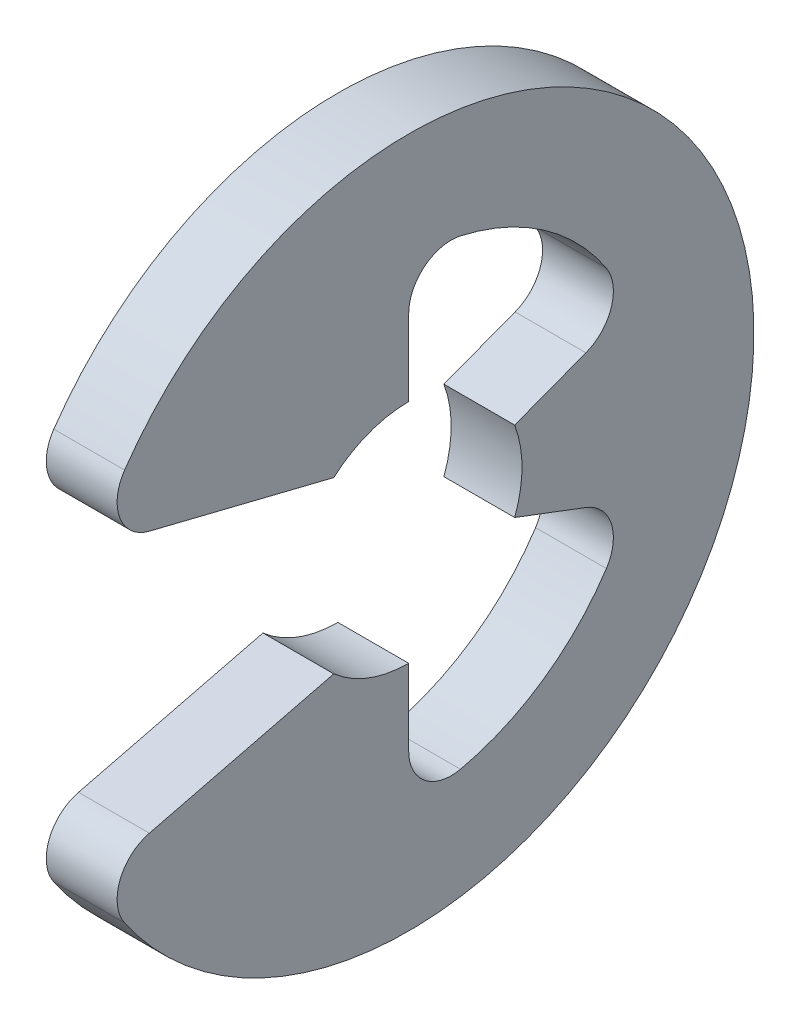
ISO-10303-21;
HEADER;
FILE_DESCRIPTION(('STEP AP214'),'2;1');
FILE_NAME('part.step','',(''),(''),'','','');
FILE_SCHEMA(('AUTOMOTIVE_DESIGN { 1 0 10303 214 1 1 1 1 }'));
ENDSEC;
DATA;
#1=APPLICATION_CONTEXT('core data for automotive mechanical design processes');
#2=APPLICATION_PROTOCOL_DEFINITION('international standard','automotive_design',2000,#1);
#3=PRODUCT_CONTEXT('',#1,'mechanical');
#4=PRODUCT('Part','Part','',(#3));
#5=PRODUCT_RELATED_PRODUCT_CATEGORY('part','',(#4));
#6=PRODUCT_DEFINITION_FORMATION('','',#4);
#7=PRODUCT_DEFINITION_CONTEXT('part definition',#1,'design');
#8=PRODUCT_DEFINITION('design','',#6,#7);
#9=PRODUCT_DEFINITION_SHAPE('','',#8);
#10=(LENGTH_UNIT() NAMED_UNIT(*) SI_UNIT(.MILLI.,.METRE.));
#11=(NAMED_UNIT(*) PLANE_ANGLE_UNIT() SI_UNIT($,.RADIAN.));
#12=(NAMED_UNIT(*) SI_UNIT($,.STERADIAN.) SOLID_ANGLE_UNIT());
#13=UNCERTAINTY_MEASURE_WITH_UNIT(LENGTH_MEASURE(1.E-05),#10,'distance_accuracy_value','');
#14=(GEOMETRIC_REPRESENTATION_CONTEXT(3) GLOBAL_UNCERTAINTY_ASSIGNED_CONTEXT((#13)) GLOBAL_UNIT_ASSIGNED_CONTEXT((#10,
#11,#12)) REPRESENTATION_CONTEXT('',''));
#15=CARTESIAN_POINT('',(0.,0.,0.));
#16=DIRECTION('',(0.,0.,1.));
#17=DIRECTION('',(1.,0.,0.));
#18=AXIS2_PLACEMENT_3D('',#15,#16,#17);
#19=CARTESIAN_POINT('',(0.2,0.,0.));
#20=DIRECTION('',(-1.,0.,0.));
#21=DIRECTION('',(0.,0.,1.));
#22=AXIS2_PLACEMENT_3D('',#19,#20,#21);
#23=CYLINDRICAL_SURFACE('',#22,1.95);
#24=CARTESIAN_POINT('',(0.2,0.,0.));
#25=DIRECTION('',(1.,0.,0.));
#26=DIRECTION('',(0.,0.,-1.));
#27=AXIS2_PLACEMENT_3D('',#24,#25,#26);
#28=CIRCLE('',#27,1.95);
#29=CARTESIAN_POINT('',(0.2,-1.10790730613089,1.60469355361757));
#30=VERTEX_POINT('',#29);
#31=CARTESIAN_POINT('',(0.2,1.10790730613089,1.60469355361757));
#32=VERTEX_POINT('',#31);
#33=EDGE_CURVE('E170',#30,#32,#28,.T.);
#34=ORIENTED_EDGE('',*,*,#33,.F.);
#35=DIRECTION('',(-1.,0.,0.));
#36=VECTOR('',#35,1.);
#37=CARTESIAN_POINT('',(0.2,-1.10790730613089,1.60469355361757));
#38=LINE('',#37,#36);
#39=CARTESIAN_POINT('',(-0.2,-1.10790730613089,1.60469355361757));
#40=VERTEX_POINT('',#39);
#41=EDGE_CURVE('E264',#30,#40,#38,.T.);
#42=ORIENTED_EDGE('',*,*,#41,.T.);
#43=CARTESIAN_POINT('',(-0.2,0.,0.));
#44=DIRECTION('',(1.,0.,0.));
#45=DIRECTION('',(0.,0.,-1.));
#46=AXIS2_PLACEMENT_3D('',#43,#44,#45);
#47=CIRCLE('',#46,1.95);
#48=CARTESIAN_POINT('',(-0.2,1.10790730613089,1.60469355361757));
#49=VERTEX_POINT('',#48);
#50=EDGE_CURVE('E208',#40,#49,#47,.T.);
#51=ORIENTED_EDGE('',*,*,#50,.T.);
#52=DIRECTION('',(-1.,0.,0.));
#53=VECTOR('',#52,1.);
#54=CARTESIAN_POINT('',(0.2,1.10790730613089,1.60469355361757));
#55=LINE('',#54,#53);
#56=EDGE_CURVE('E262',#49,#32,#55,.F.);
#57=ORIENTED_EDGE('',*,*,#56,.T.);
#58=EDGE_LOOP('',(#34,#42,#51,#57));
#59=FACE_BOUND('',#58,.T.);
#60=ADVANCED_FACE('F32',(#59),#23,.T.);
#61=CARTESIAN_POINT('',(0.2,0.81474305930666,1.77163589580693));
#62=DIRECTION('',(0.,0.970536829925373,-0.240952820606872));
#63=DIRECTION('',(0.,0.240952820606872,0.970536829925373));
#64=AXIS2_PLACEMENT_3D('',#61,#62,#63);
#65=PLANE('',#64);
#66=DIRECTION('',(0.,-0.240952820606872,-0.970536829925373));
#67=VECTOR('',#66,1.);
#68=CARTESIAN_POINT('',(0.2,0.81474305930666,1.77163589580693));
#69=LINE('',#68,#67);
#70=CARTESIAN_POINT('',(0.2,0.738620644655768,1.4650214855026));
#71=VERTEX_POINT('',#70);
#72=CARTESIAN_POINT('',(0.2,0.48,0.423320209770334));
#73=VERTEX_POINT('',#72);
#74=EDGE_CURVE('E156',#71,#73,#69,.T.);
#75=ORIENTED_EDGE('',*,*,#74,.F.);
#76=DIRECTION('',(-1.,0.,0.));
#77=VECTOR('',#76,1.);
#78=CARTESIAN_POINT('',(0.2,0.738620644655768,1.4650214855026));
#79=LINE('',#78,#77);
#80=CARTESIAN_POINT('',(-0.2,0.738620644655768,1.4650214855026));
#81=VERTEX_POINT('',#80);
#82=EDGE_CURVE('E276',#71,#81,#79,.T.);
#83=ORIENTED_EDGE('',*,*,#82,.T.);
#84=DIRECTION('',(0.,-0.240952820606872,-0.970536829925373));
#85=VECTOR('',#84,1.);
#86=CARTESIAN_POINT('',(-0.2,0.81474305930666,1.77163589580693));
#87=LINE('',#86,#85);
#88=CARTESIAN_POINT('',(-0.2,0.48,0.423320209770334));
#89=VERTEX_POINT('',#88);
#90=EDGE_CURVE('E176',#81,#89,#87,.T.);
#91=ORIENTED_EDGE('',*,*,#90,.T.);
#92=DIRECTION('',(-1.,0.,0.));
#93=VECTOR('',#92,1.);
#94=CARTESIAN_POINT('',(0.2,0.48,0.423320209770334));
#95=LINE('',#94,#93);
#96=EDGE_CURVE('E173',#73,#89,#95,.T.);
#97=ORIENTED_EDGE('',*,*,#96,.F.);
#98=EDGE_LOOP('',(#75,#83,#91,#97));
#99=FACE_BOUND('',#98,.T.);
#100=ADVANCED_FACE('F174',(#99),#65,.F.);
#101=CARTESIAN_POINT('',(0.2,0.,0.));
#102=DIRECTION('',(-1.,0.,0.));
#103=DIRECTION('',(0.,0.,1.));
#104=AXIS2_PLACEMENT_3D('',#101,#102,#103);
#105=CYLINDRICAL_SURFACE('',#104,0.64);
#106=CARTESIAN_POINT('',(-0.2,0.,0.));
#107=DIRECTION('',(-1.,0.,0.));
#108=DIRECTION('',(0.,0.,1.));
#109=AXIS2_PLACEMENT_3D('',#106,#107,#108);
#110=CIRCLE('',#109,0.64);
#111=CARTESIAN_POINT('',(-0.2,0.64,0.));
#112=VERTEX_POINT('',#111);
#113=EDGE_CURVE('E212',#89,#112,#110,.T.);
#114=ORIENTED_EDGE('',*,*,#113,.T.);
#115=DIRECTION('',(-1.,0.,0.));
#116=VECTOR('',#115,1.);
#117=CARTESIAN_POINT('',(0.2,0.64,0.));
#118=LINE('',#117,#116);
#119=CARTESIAN_POINT('',(0.2,0.64,0.));
#120=VERTEX_POINT('',#119);
#121=EDGE_CURVE('E180',#120,#112,#118,.T.);
#122=ORIENTED_EDGE('',*,*,#121,.F.);
#123=CARTESIAN_POINT('',(0.2,0.,0.));
#124=DIRECTION('',(-1.,0.,0.));
#125=DIRECTION('',(0.,0.,1.));
#126=AXIS2_PLACEMENT_3D('',#123,#124,#125);
#127=CIRCLE('',#126,0.64);
#128=EDGE_CURVE('E162',#73,#120,#127,.T.);
#129=ORIENTED_EDGE('',*,*,#128,.F.);
#130=ORIENTED_EDGE('',*,*,#96,.T.);
#131=EDGE_LOOP('',(#114,#122,#129,#130));
#132=FACE_BOUND('',#131,.T.);
#133=ADVANCED_FACE('F182',(#132),#105,.F.);
#134=CARTESIAN_POINT('',(0.2,0.64,0.));
#135=DIRECTION('',(0.,0.,1.));
#136=DIRECTION('',(0.,-1.,0.));
#137=AXIS2_PLACEMENT_3D('',#134,#135,#136);
#138=PLANE('',#137);
#139=DIRECTION('',(0.,1.,0.));
#140=VECTOR('',#139,1.);
#141=CARTESIAN_POINT('',(-0.2,0.64,0.));
#142=LINE('',#141,#140);
#143=CARTESIAN_POINT('',(-0.2,1.07019326835564,0.));
#144=VERTEX_POINT('',#143);
#145=EDGE_CURVE('E214',#112,#144,#142,.T.);
#146=ORIENTED_EDGE('',*,*,#145,.T.);
#147=DIRECTION('',(1.,0.,0.));
#148=VECTOR('',#147,1.);
#149=CARTESIAN_POINT('',(0.2,1.07019326835564,0.));
#150=LINE('',#149,#148);
#151=CARTESIAN_POINT('',(0.2,1.07019326835564,0.));
#152=VERTEX_POINT('',#151);
#153=EDGE_CURVE('E260',#144,#152,#150,.T.);
#154=ORIENTED_EDGE('',*,*,#153,.T.);
#155=DIRECTION('',(0.,1.,0.));
#156=VECTOR('',#155,1.);
#157=CARTESIAN_POINT('',(0.2,0.64,0.));
#158=LINE('',#157,#156);
#159=EDGE_CURVE('E185',#120,#152,#158,.T.);
#160=ORIENTED_EDGE('',*,*,#159,.F.);
#161=ORIENTED_EDGE('',*,*,#121,.T.);
#162=EDGE_LOOP('',(#146,#154,#160,#161));
#163=FACE_BOUND('',#162,.T.);
#164=ADVANCED_FACE('F382',(#163),#138,.F.);
#165=CARTESIAN_POINT('',(0.2,0.,0.));
#166=DIRECTION('',(-1.,0.,0.));
#167=DIRECTION('',(0.,0.,1.));
#168=AXIS2_PLACEMENT_3D('',#165,#166,#167);
#169=CYLINDRICAL_SURFACE('',#168,1.33677419354839);
#170=CARTESIAN_POINT('',(0.2,0.,0.));
#171=DIRECTION('',(-1.,0.,0.));
#172=DIRECTION('',(0.,0.,-1.));
#173=AXIS2_PLACEMENT_3D('',#170,#171,#172);
#174=CIRCLE('',#173,1.33677419354839);
#175=CARTESIAN_POINT('',(0.2,1.30437673648993,-0.292517647058821));
#176=VERTEX_POINT('',#175);
#177=CARTESIAN_POINT('',(0.2,0.734792021516849,-1.11671210687989));
#178=VERTEX_POINT('',#177);
#179=EDGE_CURVE('E187',#176,#178,#174,.T.);
#180=ORIENTED_EDGE('',*,*,#179,.F.);
#181=DIRECTION('',(-1.,0.,0.));
#182=VECTOR('',#181,1.);
#183=CARTESIAN_POINT('',(0.2,1.30437673648993,-0.292517647058821));
#184=LINE('',#183,#182);
#185=CARTESIAN_POINT('',(-0.2,1.30437673648993,-0.292517647058821));
#186=VERTEX_POINT('',#185);
#187=EDGE_CURVE('E257',#176,#186,#184,.T.);
#188=ORIENTED_EDGE('',*,*,#187,.T.);
#189=CARTESIAN_POINT('',(-0.2,0.,0.));
#190=DIRECTION('',(-1.,0.,0.));
#191=DIRECTION('',(0.,0.,-1.));
#192=AXIS2_PLACEMENT_3D('',#189,#190,#191);
#193=CIRCLE('',#192,1.33677419354839);
#194=CARTESIAN_POINT('',(-0.2,0.734792021516849,-1.11671210687989));
#195=VERTEX_POINT('',#194);
#196=EDGE_CURVE('E217',#186,#195,#193,.T.);
#197=ORIENTED_EDGE('',*,*,#196,.T.);
#198=DIRECTION('',(-1.,0.,0.));
#199=VECTOR('',#198,1.);
#200=CARTESIAN_POINT('',(0.2,0.73479202151685,-1.11671210687989));
#201=LINE('',#200,#199);
#202=EDGE_CURVE('E255',#195,#178,#201,.F.);
#203=ORIENTED_EDGE('',*,*,#202,.T.);
#204=EDGE_LOOP('',(#180,#188,#197,#203));
#205=FACE_BOUND('',#204,.T.);
#206=ADVANCED_FACE('F304',(#205),#169,.F.);
#207=CARTESIAN_POINT('',(0.2,0.226274169979695,-0.598665181883831));
#208=DIRECTION('',(0.,-0.935414346693484,-0.353553390593278));
#209=DIRECTION('',(0.,0.353553390593278,-0.935414346693484));
#210=AXIS2_PLACEMENT_3D('',#207,#208,#209);
#211=PLANE('',#210);
#212=DIRECTION('',(0.,-0.353553390593278,0.935414346693484));
#213=VECTOR('',#212,1.);
#214=CARTESIAN_POINT('',(0.2,0.226274169979695,-0.598665181883831));
#215=LINE('',#214,#213);
#216=CARTESIAN_POINT('',(0.2,0.378370458617234,-1.00107413695465));
#217=VERTEX_POINT('',#216);
#218=CARTESIAN_POINT('',(0.2,0.226274169979695,-0.598665181883831));
#219=VERTEX_POINT('',#218);
#220=EDGE_CURVE('E192',#217,#219,#215,.T.);
#221=ORIENTED_EDGE('',*,*,#220,.F.);
#222=DIRECTION('',(1.,0.,0.));
#223=VECTOR('',#222,1.);
#224=CARTESIAN_POINT('',(-0.2,0.378370458617234,-1.00107413695465));
#225=LINE('',#224,#223);
#226=CARTESIAN_POINT('',(-0.2,0.378370458617234,-1.00107413695465));
#227=VERTEX_POINT('',#226);
#228=EDGE_CURVE('E279',#217,#227,#225,.F.);
#229=ORIENTED_EDGE('',*,*,#228,.T.);
#230=DIRECTION('',(0.,-0.353553390593278,0.935414346693484));
#231=VECTOR('',#230,1.);
#232=CARTESIAN_POINT('',(-0.2,0.226274169979695,-0.598665181883831));
#233=LINE('',#232,#231);
#234=CARTESIAN_POINT('',(-0.2,0.226274169979695,-0.598665181883831));
#235=VERTEX_POINT('',#234);
#236=EDGE_CURVE('E220',#227,#235,#233,.T.);
#237=ORIENTED_EDGE('',*,*,#236,.T.);
#238=DIRECTION('',(-1.,0.,0.));
#239=VECTOR('',#238,1.);
#240=CARTESIAN_POINT('',(0.2,0.226274169979695,-0.598665181883831));
#241=LINE('',#240,#239);
#242=EDGE_CURVE('E244',#219,#235,#241,.T.);
#243=ORIENTED_EDGE('',*,*,#242,.F.);
#244=EDGE_LOOP('',(#221,#229,#237,#243));
#245=FACE_BOUND('',#244,.T.);
#246=ADVANCED_FACE('F307',(#245),#211,.F.);
#247=CARTESIAN_POINT('',(0.2,0.,0.));
#248=DIRECTION('',(-1.,0.,0.));
#249=DIRECTION('',(0.,0.,1.));
#250=AXIS2_PLACEMENT_3D('',#247,#248,#249);
#251=CYLINDRICAL_SURFACE('',#250,0.64);
#252=CARTESIAN_POINT('',(-0.2,0.,0.));
#253=DIRECTION('',(-1.,0.,0.));
#254=DIRECTION('',(0.,0.,1.));
#255=AXIS2_PLACEMENT_3D('',#252,#253,#254);
#256=CIRCLE('',#255,0.64);
#257=CARTESIAN_POINT('',(-0.2,-0.226274169979695,-0.598665181883831));
#258=VERTEX_POINT('',#257);
#259=EDGE_CURVE('E222',#235,#258,#256,.T.);
#260=ORIENTED_EDGE('',*,*,#259,.T.);
#261=DIRECTION('',(-1.,0.,0.));
#262=VECTOR('',#261,1.);
#263=CARTESIAN_POINT('',(0.2,-0.226274169979695,-0.598665181883831));
#264=LINE('',#263,#262);
#265=CARTESIAN_POINT('',(0.2,-0.226274169979695,-0.598665181883831));
#266=VERTEX_POINT('',#265);
#267=EDGE_CURVE('E241',#266,#258,#264,.T.);
#268=ORIENTED_EDGE('',*,*,#267,.F.);
#269=CARTESIAN_POINT('',(0.2,0.,0.));
#270=DIRECTION('',(-1.,0.,0.));
#271=DIRECTION('',(0.,0.,1.));
#272=AXIS2_PLACEMENT_3D('',#269,#270,#271);
#273=CIRCLE('',#272,0.64);
#274=EDGE_CURVE('E194',#219,#266,#273,.T.);
#275=ORIENTED_EDGE('',*,*,#274,.F.);
#276=ORIENTED_EDGE('',*,*,#242,.T.);
#277=EDGE_LOOP('',(#260,#268,#275,#276));
#278=FACE_BOUND('',#277,.T.);
#279=ADVANCED_FACE('F313',(#278),#251,.F.);
#280=CARTESIAN_POINT('',(0.2,-0.226274169979695,-0.598665181883831));
#281=DIRECTION('',(0.,0.935414346693484,-0.353553390593278));
#282=DIRECTION('',(0.,0.353553390593278,0.935414346693484));
#283=AXIS2_PLACEMENT_3D('',#280,#281,#282);
#284=PLANE('',#283);
#285=DIRECTION('',(0.,-0.353553390593278,-0.935414346693484));
#286=VECTOR('',#285,1.);
#287=CARTESIAN_POINT('',(-0.2,-0.226274169979695,-0.598665181883831));
#288=LINE('',#287,#286);
#289=CARTESIAN_POINT('',(-0.2,-0.378370458617234,-1.00107413695465));
#290=VERTEX_POINT('',#289);
#291=EDGE_CURVE('E224',#258,#290,#288,.T.);
#292=ORIENTED_EDGE('',*,*,#291,.T.);
#293=DIRECTION('',(1.,0.,0.));
#294=VECTOR('',#293,1.);
#295=CARTESIAN_POINT('',(0.2,-0.378370458617234,-1.00107413695465));
#296=LINE('',#295,#294);
#297=CARTESIAN_POINT('',(0.2,-0.378370458617234,-1.00107413695465));
#298=VERTEX_POINT('',#297);
#299=EDGE_CURVE('E47',#290,#298,#296,.T.);
#300=ORIENTED_EDGE('',*,*,#299,.T.);
#301=DIRECTION('',(0.,-0.353553390593278,-0.935414346693484));
#302=VECTOR('',#301,1.);
#303=CARTESIAN_POINT('',(0.2,-0.226274169979695,-0.598665181883831));
#304=LINE('',#303,#302);
#305=EDGE_CURVE('E196',#266,#298,#304,.T.);
#306=ORIENTED_EDGE('',*,*,#305,.F.);
#307=ORIENTED_EDGE('',*,*,#267,.T.);
#308=EDGE_LOOP('',(#292,#300,#306,#307));
#309=FACE_BOUND('',#308,.T.);
#310=ADVANCED_FACE('F315',(#309),#284,.F.);
#311=CARTESIAN_POINT('',(0.2,0.,0.));
#312=DIRECTION('',(-1.,0.,0.));
#313=DIRECTION('',(0.,0.,1.));
#314=AXIS2_PLACEMENT_3D('',#311,#312,#313);
#315=CYLINDRICAL_SURFACE('',#314,1.33677419354839);
#316=CARTESIAN_POINT('',(-0.2,0.,0.));
#317=DIRECTION('',(-1.,0.,0.));
#318=DIRECTION('',(0.,0.,-1.));
#319=AXIS2_PLACEMENT_3D('',#316,#317,#318);
#320=CIRCLE('',#319,1.33677419354839);
#321=CARTESIAN_POINT('',(-0.2,-0.734792021516849,-1.11671210687989));
#322=VERTEX_POINT('',#321);
#323=CARTESIAN_POINT('',(-0.2,-1.30437673648993,-0.292517647058822));
#324=VERTEX_POINT('',#323);
#325=EDGE_CURVE('E226',#322,#324,#320,.T.);
#326=ORIENTED_EDGE('',*,*,#325,.T.);
#327=DIRECTION('',(-1.,0.,0.));
#328=VECTOR('',#327,1.);
#329=CARTESIAN_POINT('',(0.2,-1.30437673648993,-0.292517647058822));
#330=LINE('',#329,#328);
#331=CARTESIAN_POINT('',(0.2,-1.30437673648993,-0.292517647058822));
#332=VERTEX_POINT('',#331);
#333=EDGE_CURVE('E253',#324,#332,#330,.F.);
#334=ORIENTED_EDGE('',*,*,#333,.T.);
#335=CARTESIAN_POINT('',(0.2,0.,0.));
#336=DIRECTION('',(-1.,0.,0.));
#337=DIRECTION('',(0.,0.,-1.));
#338=AXIS2_PLACEMENT_3D('',#335,#336,#337);
#339=CIRCLE('',#338,1.33677419354839);
#340=CARTESIAN_POINT('',(0.2,-0.734792021516849,-1.11671210687989));
#341=VERTEX_POINT('',#340);
#342=EDGE_CURVE('E198',#341,#332,#339,.T.);
#343=ORIENTED_EDGE('',*,*,#342,.F.);
#344=DIRECTION('',(-1.,0.,0.));
#345=VECTOR('',#344,1.);
#346=CARTESIAN_POINT('',(0.2,-0.73479202151685,-1.11671210687989));
#347=LINE('',#346,#345);
#348=EDGE_CURVE('E250',#341,#322,#347,.T.);
#349=ORIENTED_EDGE('',*,*,#348,.T.);
#350=EDGE_LOOP('',(#326,#334,#343,#349));
#351=FACE_BOUND('',#350,.T.);
#352=ADVANCED_FACE('F317',(#351),#315,.F.);
#353=CARTESIAN_POINT('',(0.2,-0.64,0.));
#354=DIRECTION('',(0.,0.,1.));
#355=DIRECTION('',(0.,-1.,0.));
#356=AXIS2_PLACEMENT_3D('',#353,#354,#355);
#357=PLANE('',#356);
#358=DIRECTION('',(0.,1.,0.));
#359=VECTOR('',#358,1.);
#360=CARTESIAN_POINT('',(0.2,-0.64,0.));
#361=LINE('',#360,#359);
#362=CARTESIAN_POINT('',(0.2,-1.07019326835564,0.));
#363=VERTEX_POINT('',#362);
#364=CARTESIAN_POINT('',(0.2,-0.64,0.));
#365=VERTEX_POINT('',#364);
#366=EDGE_CURVE('E201',#363,#365,#361,.T.);
#367=ORIENTED_EDGE('',*,*,#366,.F.);
#368=DIRECTION('',(1.,0.,0.));
#369=VECTOR('',#368,1.);
#370=CARTESIAN_POINT('',(-0.2,-1.07019326835564,0.));
#371=LINE('',#370,#369);
#372=CARTESIAN_POINT('',(-0.2,-1.07019326835564,0.));
#373=VERTEX_POINT('',#372);
#374=EDGE_CURVE('E179',#363,#373,#371,.F.);
#375=ORIENTED_EDGE('',*,*,#374,.T.);
#376=DIRECTION('',(0.,1.,0.));
#377=VECTOR('',#376,1.);
#378=CARTESIAN_POINT('',(-0.2,-0.64,0.));
#379=LINE('',#378,#377);
#380=CARTESIAN_POINT('',(-0.2,-0.64,0.));
#381=VERTEX_POINT('',#380);
#382=EDGE_CURVE('E229',#373,#381,#379,.T.);
#383=ORIENTED_EDGE('',*,*,#382,.T.);
#384=DIRECTION('',(-1.,0.,0.));
#385=VECTOR('',#384,1.);
#386=CARTESIAN_POINT('',(0.2,-0.64,0.));
#387=LINE('',#386,#385);
#388=EDGE_CURVE('E238',#365,#381,#387,.T.);
#389=ORIENTED_EDGE('',*,*,#388,.F.);
#390=EDGE_LOOP('',(#367,#375,#383,#389));
#391=FACE_BOUND('',#390,.T.);
#392=ADVANCED_FACE('F323',(#391),#357,.F.);
#393=CARTESIAN_POINT('',(0.2,0.,0.));
#394=DIRECTION('',(-1.,0.,0.));
#395=DIRECTION('',(0.,0.,1.));
#396=AXIS2_PLACEMENT_3D('',#393,#394,#395);
#397=CYLINDRICAL_SURFACE('',#396,0.64);
#398=CARTESIAN_POINT('',(-0.2,0.,0.));
#399=DIRECTION('',(-1.,0.,0.));
#400=DIRECTION('',(0.,0.,-1.));
#401=AXIS2_PLACEMENT_3D('',#398,#399,#400);
#402=CIRCLE('',#401,0.64);
#403=CARTESIAN_POINT('',(-0.2,-0.48,0.423320209770334));
#404=VERTEX_POINT('',#403);
#405=EDGE_CURVE('E231',#381,#404,#402,.T.);
#406=ORIENTED_EDGE('',*,*,#405,.T.);
#407=DIRECTION('',(-1.,0.,0.));
#408=VECTOR('',#407,1.);
#409=CARTESIAN_POINT('',(0.2,-0.48,0.423320209770334));
#410=LINE('',#409,#408);
#411=CARTESIAN_POINT('',(0.2,-0.48,0.423320209770334));
#412=VERTEX_POINT('',#411);
#413=EDGE_CURVE('E207',#412,#404,#410,.T.);
#414=ORIENTED_EDGE('',*,*,#413,.F.);
#415=CARTESIAN_POINT('',(0.2,0.,0.));
#416=DIRECTION('',(-1.,0.,0.));
#417=DIRECTION('',(0.,0.,-1.));
#418=AXIS2_PLACEMENT_3D('',#415,#416,#417);
#419=CIRCLE('',#418,0.64);
#420=EDGE_CURVE('E203',#365,#412,#419,.T.);
#421=ORIENTED_EDGE('',*,*,#420,.F.);
#422=ORIENTED_EDGE('',*,*,#388,.T.);
#423=EDGE_LOOP('',(#406,#414,#421,#422));
#424=FACE_BOUND('',#423,.T.);
#425=ADVANCED_FACE('F372',(#424),#397,.F.);
#426=CARTESIAN_POINT('',(0.2,-0.81474305930666,1.77163589580693));
#427=DIRECTION('',(0.,-0.970536829925373,-0.240952820606872));
#428=DIRECTION('',(0.,0.240952820606872,-0.970536829925373));
#429=AXIS2_PLACEMENT_3D('',#426,#427,#428);
#430=PLANE('',#429);
#431=DIRECTION('',(0.,-0.240952820606872,0.970536829925373));
#432=VECTOR('',#431,1.);
#433=CARTESIAN_POINT('',(-0.2,-0.81474305930666,1.77163589580693));
#434=LINE('',#433,#432);
#435=CARTESIAN_POINT('',(-0.2,-0.738620644655768,1.4650214855026));
#436=VERTEX_POINT('',#435);
#437=EDGE_CURVE('E233',#404,#436,#434,.T.);
#438=ORIENTED_EDGE('',*,*,#437,.T.);
#439=DIRECTION('',(-1.,0.,0.));
#440=VECTOR('',#439,1.);
#441=CARTESIAN_POINT('',(0.2,-0.738620644655768,1.4650214855026));
#442=LINE('',#441,#440);
#443=CARTESIAN_POINT('',(0.2,-0.738620644655768,1.4650214855026));
#444=VERTEX_POINT('',#443);
#445=EDGE_CURVE('E271',#436,#444,#442,.F.);
#446=ORIENTED_EDGE('',*,*,#445,.T.);
#447=DIRECTION('',(0.,-0.240952820606872,0.970536829925373));
#448=VECTOR('',#447,1.);
#449=CARTESIAN_POINT('',(0.2,-0.81474305930666,1.77163589580693));
#450=LINE('',#449,#448);
#451=EDGE_CURVE('E205',#412,#444,#450,.T.);
#452=ORIENTED_EDGE('',*,*,#451,.F.);
#453=ORIENTED_EDGE('',*,*,#413,.T.);
#454=EDGE_LOOP('',(#438,#446,#452,#453));
#455=FACE_BOUND('',#454,.T.);
#456=ADVANCED_FACE('F414',(#455),#430,.F.);
#457=CARTESIAN_POINT('',(0.2,0.,0.));
#458=DIRECTION('',(1.,0.,0.));
#459=DIRECTION('',(0.,0.,-1.));
#460=AXIS2_PLACEMENT_3D('',#457,#458,#459);
#461=PLANE('',#460);
#462=ORIENTED_EDGE('',*,*,#451,.T.);
#463=CARTESIAN_POINT('',(0.2,-0.971549483837857,1.40719280855695));
#464=DIRECTION('',(1.,0.,0.));
#465=DIRECTION('',(0.,0.,-1.));
#466=AXIS2_PLACEMENT_3D('',#463,#464,#465);
#467=CIRCLE('',#466,0.24);
#468=EDGE_CURVE('E274',#444,#30,#467,.T.);
#469=ORIENTED_EDGE('',*,*,#468,.T.);
#470=ORIENTED_EDGE('',*,*,#33,.T.);
#471=CARTESIAN_POINT('',(0.2,0.971549483837857,1.40719280855695));
#472=DIRECTION('',(1.,0.,0.));
#473=DIRECTION('',(0.,0.,-1.));
#474=AXIS2_PLACEMENT_3D('',#471,#472,#473);
#475=CIRCLE('',#474,0.24);
#476=EDGE_CURVE('E166',#32,#71,#475,.T.);
#477=ORIENTED_EDGE('',*,*,#476,.T.);
#478=ORIENTED_EDGE('',*,*,#74,.T.);
#479=ORIENTED_EDGE('',*,*,#128,.T.);
#480=ORIENTED_EDGE('',*,*,#159,.T.);
#481=CARTESIAN_POINT('',(0.2,1.07019326835564,-0.239999999999998));
#482=DIRECTION('',(1.,0.,0.));
#483=DIRECTION('',(0.,0.,-1.));
#484=AXIS2_PLACEMENT_3D('',#481,#482,#483);
#485=CIRCLE('',#484,0.24);
#486=EDGE_CURVE('E288',#152,#176,#485,.F.);
#487=ORIENTED_EDGE('',*,*,#486,.T.);
#488=ORIENTED_EDGE('',*,*,#179,.T.);
#489=CARTESIAN_POINT('',(0.2,0.60286990182367,-0.916221323212266));
#490=DIRECTION('',(1.,0.,0.));
#491=DIRECTION('',(0.,0.,-1.));
#492=AXIS2_PLACEMENT_3D('',#489,#490,#491);
#493=CIRCLE('',#492,0.24);
#494=EDGE_CURVE('E11',#178,#217,#493,.F.);
#495=ORIENTED_EDGE('',*,*,#494,.T.);
#496=ORIENTED_EDGE('',*,*,#220,.T.);
#497=ORIENTED_EDGE('',*,*,#274,.T.);
#498=ORIENTED_EDGE('',*,*,#305,.T.);
#499=CARTESIAN_POINT('',(0.2,-0.60286990182367,-0.916221323212266));
#500=DIRECTION('',(1.,0.,0.));
#501=DIRECTION('',(0.,0.,-1.));
#502=AXIS2_PLACEMENT_3D('',#499,#500,#501);
#503=CIRCLE('',#502,0.24);
#504=EDGE_CURVE('E292',#298,#341,#503,.F.);
#505=ORIENTED_EDGE('',*,*,#504,.T.);
#506=ORIENTED_EDGE('',*,*,#342,.T.);
#507=CARTESIAN_POINT('',(0.2,-1.07019326835564,-0.239999999999999));
#508=DIRECTION('',(1.,0.,0.));
#509=DIRECTION('',(0.,0.,-1.));
#510=AXIS2_PLACEMENT_3D('',#507,#508,#509);
#511=CIRCLE('',#510,0.24);
#512=EDGE_CURVE('E284',#332,#363,#511,.F.);
#513=ORIENTED_EDGE('',*,*,#512,.T.);
#514=ORIENTED_EDGE('',*,*,#366,.T.);
#515=ORIENTED_EDGE('',*,*,#420,.T.);
#516=EDGE_LOOP('',(#462,#469,#470,#477,#478,#479,#480,#487,#488,#495,#496,#497,#498,#505,#506,
#513,#514,#515));
#517=FACE_BOUND('',#516,.T.);
#518=ADVANCED_FACE('F159',(#517),#461,.T.);
#519=CARTESIAN_POINT('',(-0.2,0.,0.));
#520=DIRECTION('',(1.,0.,0.));
#521=DIRECTION('',(0.,0.,-1.));
#522=AXIS2_PLACEMENT_3D('',#519,#520,#521);
#523=PLANE('',#522);
#524=ORIENTED_EDGE('',*,*,#50,.F.);
#525=CARTESIAN_POINT('',(-0.2,-0.971549483837857,1.40719280855695));
#526=DIRECTION('',(1.,0.,0.));
#527=DIRECTION('',(0.,0.,-1.));
#528=AXIS2_PLACEMENT_3D('',#525,#526,#527);
#529=CIRCLE('',#528,0.24);
#530=EDGE_CURVE('E269',#40,#436,#529,.F.);
#531=ORIENTED_EDGE('',*,*,#530,.T.);
#532=ORIENTED_EDGE('',*,*,#437,.F.);
#533=ORIENTED_EDGE('',*,*,#405,.F.);
#534=ORIENTED_EDGE('',*,*,#382,.F.);
#535=CARTESIAN_POINT('',(-0.2,-1.07019326835564,-0.239999999999999));
#536=DIRECTION('',(1.,0.,0.));
#537=DIRECTION('',(0.,0.,-1.));
#538=AXIS2_PLACEMENT_3D('',#535,#536,#537);
#539=CIRCLE('',#538,0.24);
#540=EDGE_CURVE('E282',#373,#324,#539,.T.);
#541=ORIENTED_EDGE('',*,*,#540,.T.);
#542=ORIENTED_EDGE('',*,*,#325,.F.);
#543=CARTESIAN_POINT('',(-0.2,-0.60286990182367,-0.916221323212266));
#544=DIRECTION('',(1.,0.,0.));
#545=DIRECTION('',(0.,0.,-1.));
#546=AXIS2_PLACEMENT_3D('',#543,#544,#545);
#547=CIRCLE('',#546,0.24);
#548=EDGE_CURVE('E290',#322,#290,#547,.T.);
#549=ORIENTED_EDGE('',*,*,#548,.T.);
#550=ORIENTED_EDGE('',*,*,#291,.F.);
#551=ORIENTED_EDGE('',*,*,#259,.F.);
#552=ORIENTED_EDGE('',*,*,#236,.F.);
#553=CARTESIAN_POINT('',(-0.2,0.60286990182367,-0.916221323212266));
#554=DIRECTION('',(1.,0.,0.));
#555=DIRECTION('',(0.,0.,-1.));
#556=AXIS2_PLACEMENT_3D('',#553,#554,#555);
#557=CIRCLE('',#556,0.24);
#558=EDGE_CURVE('E40',#227,#195,#557,.T.);
#559=ORIENTED_EDGE('',*,*,#558,.T.);
#560=ORIENTED_EDGE('',*,*,#196,.F.);
#561=CARTESIAN_POINT('',(-0.2,1.07019326835564,-0.239999999999998));
#562=DIRECTION('',(1.,0.,0.));
#563=DIRECTION('',(0.,0.,-1.));
#564=AXIS2_PLACEMENT_3D('',#561,#562,#563);
#565=CIRCLE('',#564,0.24);
#566=EDGE_CURVE('E286',#186,#144,#565,.T.);
#567=ORIENTED_EDGE('',*,*,#566,.T.);
#568=ORIENTED_EDGE('',*,*,#145,.F.);
#569=ORIENTED_EDGE('',*,*,#113,.F.);
#570=ORIENTED_EDGE('',*,*,#90,.F.);
#571=CARTESIAN_POINT('',(-0.2,0.971549483837857,1.40719280855695));
#572=DIRECTION('',(1.,0.,0.));
#573=DIRECTION('',(0.,0.,-1.));
#574=AXIS2_PLACEMENT_3D('',#571,#572,#573);
#575=CIRCLE('',#574,0.24);
#576=EDGE_CURVE('E267',#81,#49,#575,.F.);
#577=ORIENTED_EDGE('',*,*,#576,.T.);
#578=EDGE_LOOP('',(#524,#531,#532,#533,#534,#541,#542,#549,#550,#551,#552,#559,#560,#567,#568,
#569,#570,#577));
#579=FACE_BOUND('',#578,.T.);
#580=ADVANCED_FACE('F297',(#579),#523,.F.);
#581=CARTESIAN_POINT('',(0.2,-1.07019326835564,-0.239999999999999));
#582=DIRECTION('',(-1.,0.,0.));
#583=DIRECTION('',(0.,0.,1.));
#584=AXIS2_PLACEMENT_3D('',#581,#582,#583);
#585=CYLINDRICAL_SURFACE('',#584,0.24);
#586=ORIENTED_EDGE('',*,*,#512,.F.);
#587=ORIENTED_EDGE('',*,*,#333,.F.);
#588=ORIENTED_EDGE('',*,*,#540,.F.);
#589=ORIENTED_EDGE('',*,*,#374,.F.);
#590=EDGE_LOOP('',(#586,#587,#588,#589));
#591=FACE_BOUND('',#590,.T.);
#592=ADVANCED_FACE('F337',(#591),#585,.F.);
#593=CARTESIAN_POINT('',(0.2,1.07019326835564,-0.239999999999998));
#594=DIRECTION('',(-1.,0.,0.));
#595=DIRECTION('',(0.,0.,1.));
#596=AXIS2_PLACEMENT_3D('',#593,#594,#595);
#597=CYLINDRICAL_SURFACE('',#596,0.24);
#598=ORIENTED_EDGE('',*,*,#486,.F.);
#599=ORIENTED_EDGE('',*,*,#153,.F.);
#600=ORIENTED_EDGE('',*,*,#566,.F.);
#601=ORIENTED_EDGE('',*,*,#187,.F.);
#602=EDGE_LOOP('',(#598,#599,#600,#601));
#603=FACE_BOUND('',#602,.T.);
#604=ADVANCED_FACE('F340',(#603),#597,.F.);
#605=CARTESIAN_POINT('',(0.2,-0.971549483837857,1.40719280855695));
#606=DIRECTION('',(-1.,0.,0.));
#607=DIRECTION('',(0.,0.,1.));
#608=AXIS2_PLACEMENT_3D('',#605,#606,#607);
#609=CYLINDRICAL_SURFACE('',#608,0.24);
#610=ORIENTED_EDGE('',*,*,#468,.F.);
#611=ORIENTED_EDGE('',*,*,#445,.F.);
#612=ORIENTED_EDGE('',*,*,#530,.F.);
#613=ORIENTED_EDGE('',*,*,#41,.F.);
#614=EDGE_LOOP('',(#610,#611,#612,#613));
#615=FACE_BOUND('',#614,.T.);
#616=ADVANCED_FACE('F344',(#615),#609,.T.);
#617=CARTESIAN_POINT('',(0.2,0.971549483837857,1.40719280855695));
#618=DIRECTION('',(-1.,0.,0.));
#619=DIRECTION('',(0.,0.,1.));
#620=AXIS2_PLACEMENT_3D('',#617,#618,#619);
#621=CYLINDRICAL_SURFACE('',#620,0.24);
#622=ORIENTED_EDGE('',*,*,#476,.F.);
#623=ORIENTED_EDGE('',*,*,#56,.F.);
#624=ORIENTED_EDGE('',*,*,#576,.F.);
#625=ORIENTED_EDGE('',*,*,#82,.F.);
#626=EDGE_LOOP('',(#622,#623,#624,#625));
#627=FACE_BOUND('',#626,.T.);
#628=ADVANCED_FACE('F348',(#627),#621,.T.);
#629=CARTESIAN_POINT('',(0.2,-0.60286990182367,-0.916221323212266));
#630=DIRECTION('',(-1.,0.,0.));
#631=DIRECTION('',(0.,0.,1.));
#632=AXIS2_PLACEMENT_3D('',#629,#630,#631);
#633=CYLINDRICAL_SURFACE('',#632,0.24);
#634=ORIENTED_EDGE('',*,*,#504,.F.);
#635=ORIENTED_EDGE('',*,*,#299,.F.);
#636=ORIENTED_EDGE('',*,*,#548,.F.);
#637=ORIENTED_EDGE('',*,*,#348,.F.);
#638=EDGE_LOOP('',(#634,#635,#636,#637));
#639=FACE_BOUND('',#638,.T.);
#640=ADVANCED_FACE('F351',(#639),#633,.F.);
#641=CARTESIAN_POINT('',(0.2,0.60286990182367,-0.916221323212266));
#642=DIRECTION('',(-1.,0.,0.));
#643=DIRECTION('',(0.,0.,1.));
#644=AXIS2_PLACEMENT_3D('',#641,#642,#643);
#645=CYLINDRICAL_SURFACE('',#644,0.24);
#646=ORIENTED_EDGE('',*,*,#494,.F.);
#647=ORIENTED_EDGE('',*,*,#202,.F.);
#648=ORIENTED_EDGE('',*,*,#558,.F.);
#649=ORIENTED_EDGE('',*,*,#228,.F.);
#650=EDGE_LOOP('',(#646,#647,#648,#649));
#651=FACE_BOUND('',#650,.T.);
#652=ADVANCED_FACE('F34',(#651),#645,.F.);
#653=CLOSED_SHELL('',(#60,#100,#133,#164,#206,#246,#279,#310,#352,#392,#425,#456,#518,#580,#592,
#604,#616,#628,#640,#652));
#654=MANIFOLD_SOLID_BREP('B2',#653);
#655=ADVANCED_BREP_SHAPE_REPRESENTATION('',(#18,#654),#14);
#656=SHAPE_DEFINITION_REPRESENTATION(#9,#655);
ENDSEC;
END-ISO-10303-21;
